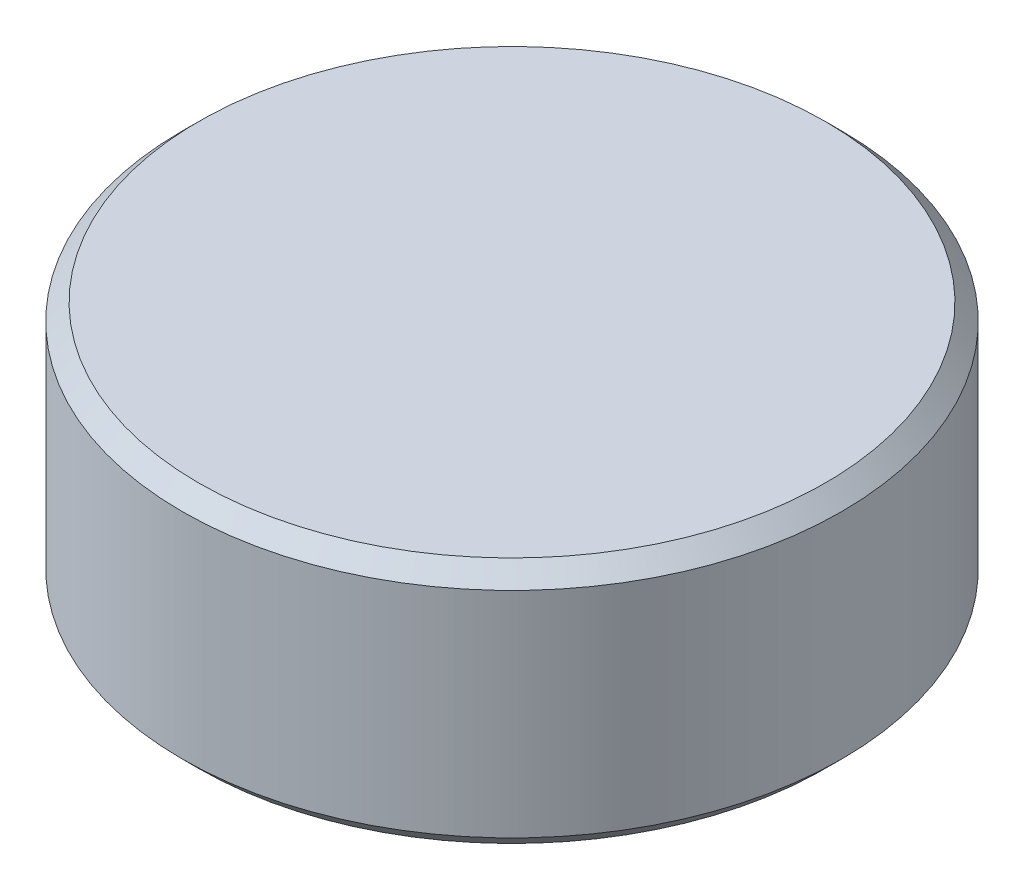
ISO-10303-21;
HEADER;
FILE_DESCRIPTION(('STEP AP214'),'2;1');
FILE_NAME('part.step','',(''),(''),'','','');
FILE_SCHEMA(('AUTOMOTIVE_DESIGN { 1 0 10303 214 1 1 1 1 }'));
ENDSEC;
DATA;
#1=APPLICATION_CONTEXT('core data for automotive mechanical design processes');
#2=APPLICATION_PROTOCOL_DEFINITION('international standard','automotive_design',2000,#1);
#3=PRODUCT_CONTEXT('',#1,'mechanical');
#4=PRODUCT('Part','Part','',(#3));
#5=PRODUCT_RELATED_PRODUCT_CATEGORY('part','',(#4));
#6=PRODUCT_DEFINITION_FORMATION('','',#4);
#7=PRODUCT_DEFINITION_CONTEXT('part definition',#1,'design');
#8=PRODUCT_DEFINITION('design','',#6,#7);
#9=PRODUCT_DEFINITION_SHAPE('','',#8);
#10=(LENGTH_UNIT() NAMED_UNIT(*) SI_UNIT(.MILLI.,.METRE.));
#11=(NAMED_UNIT(*) PLANE_ANGLE_UNIT() SI_UNIT($,.RADIAN.));
#12=(NAMED_UNIT(*) SI_UNIT($,.STERADIAN.) SOLID_ANGLE_UNIT());
#13=UNCERTAINTY_MEASURE_WITH_UNIT(LENGTH_MEASURE(1.E-05),#10,'distance_accuracy_value','');
#14=(GEOMETRIC_REPRESENTATION_CONTEXT(3) GLOBAL_UNCERTAINTY_ASSIGNED_CONTEXT((#13)) GLOBAL_UNIT_ASSIGNED_CONTEXT((#10,
#11,#12)) REPRESENTATION_CONTEXT('',''));
#15=CARTESIAN_POINT('',(0.,0.,0.));
#16=DIRECTION('',(0.,0.,1.));
#17=DIRECTION('',(1.,0.,0.));
#18=AXIS2_PLACEMENT_3D('',#15,#16,#17);
#19=CARTESIAN_POINT('',(0.,1.5,0.));
#20=DIRECTION('',(0.,-1.,0.));
#21=DIRECTION('',(0.,0.,-1.));
#22=AXIS2_PLACEMENT_3D('',#19,#20,#21);
#23=CYLINDRICAL_SURFACE('',#22,2.);
#24=CARTESIAN_POINT('',(0.,0.0999999999999998,0.));
#25=DIRECTION('',(0.,1.,0.));
#26=DIRECTION('',(0.,0.,1.));
#27=AXIS2_PLACEMENT_3D('',#24,#25,#26);
#28=CIRCLE('',#27,2.);
#29=CARTESIAN_POINT('',(0.,0.0999999999999998,2.));
#30=VERTEX_POINT('',#29);
#31=EDGE_CURVE('E57',#30,#30,#28,.T.);
#32=ORIENTED_EDGE('',*,*,#31,.T.);
#33=EDGE_LOOP('',(#32));
#34=FACE_BOUND('',#33,.T.);
#35=CARTESIAN_POINT('',(0.,1.4,0.));
#36=DIRECTION('',(0.,1.,0.));
#37=DIRECTION('',(0.,0.,1.));
#38=AXIS2_PLACEMENT_3D('',#35,#36,#37);
#39=CIRCLE('',#38,2.);
#40=CARTESIAN_POINT('',(0.,1.4,2.));
#41=VERTEX_POINT('',#40);
#42=EDGE_CURVE('E62',#41,#41,#39,.F.);
#43=ORIENTED_EDGE('',*,*,#42,.T.);
#44=EDGE_LOOP('',(#43));
#45=FACE_BOUND('',#44,.T.);
#46=ADVANCED_FACE('F43',(#34,#45),#23,.T.);
#47=CARTESIAN_POINT('',(0.,1.5,0.));
#48=DIRECTION('',(0.,1.,0.));
#49=DIRECTION('',(0.,0.,1.));
#50=AXIS2_PLACEMENT_3D('',#47,#48,#49);
#51=PLANE('',#50);
#52=CARTESIAN_POINT('',(0.,1.5,0.));
#53=DIRECTION('',(0.,1.,0.));
#54=DIRECTION('',(0.,0.,1.));
#55=AXIS2_PLACEMENT_3D('',#52,#53,#54);
#56=CIRCLE('',#55,1.9);
#57=CARTESIAN_POINT('',(0.,1.5,1.9));
#58=VERTEX_POINT('',#57);
#59=EDGE_CURVE('E10',#58,#58,#56,.T.);
#60=ORIENTED_EDGE('',*,*,#59,.T.);
#61=EDGE_LOOP('',(#60));
#62=FACE_BOUND('',#61,.T.);
#63=ADVANCED_FACE('F79',(#62),#51,.T.);
#64=CARTESIAN_POINT('',(0.,0.,0.));
#65=DIRECTION('',(0.,1.,0.));
#66=DIRECTION('',(0.,0.,1.));
#67=AXIS2_PLACEMENT_3D('',#64,#65,#66);
#68=PLANE('',#67);
#69=CARTESIAN_POINT('',(0.,0.,0.));
#70=DIRECTION('',(0.,1.,0.));
#71=DIRECTION('',(0.,0.,1.));
#72=AXIS2_PLACEMENT_3D('',#69,#70,#71);
#73=CIRCLE('',#72,1.9);
#74=CARTESIAN_POINT('',(0.,0.,1.9));
#75=VERTEX_POINT('',#74);
#76=EDGE_CURVE('E52',#75,#75,#73,.F.);
#77=ORIENTED_EDGE('',*,*,#76,.T.);
#78=EDGE_LOOP('',(#77));
#79=FACE_BOUND('',#78,.T.);
#80=ADVANCED_FACE('F76',(#79),#68,.F.);
#81=CARTESIAN_POINT('',(0.,0.0999999999999998,0.));
#82=DIRECTION('',(0.,1.,0.));
#83=DIRECTION('',(0.,0.,1.));
#84=AXIS2_PLACEMENT_3D('',#81,#82,#83);
#85=CONICAL_SURFACE('',#84,2.,0.785398163397453);
#86=CARTESIAN_POINT('',(0.,0.,1.9));
#87=CARTESIAN_POINT('',(0.,0.0010416666666666,1.90104166666667));
#88=CARTESIAN_POINT('',(0.,0.00208333333333328,1.90208333333333));
#89=CARTESIAN_POINT('',(0.,0.00416666666666664,1.90416666666667));
#90=CARTESIAN_POINT('',(0.,0.00520833333333333,1.90520833333333));
#91=CARTESIAN_POINT('',(0.,0.00729166666666666,1.90729166666667));
#92=CARTESIAN_POINT('',(0.,0.00833333333333332,1.90833333333333));
#93=CARTESIAN_POINT('',(0.,0.0104166666666666,1.91041666666667));
#94=CARTESIAN_POINT('',(0.,0.0114583333333333,1.91145833333333));
#95=CARTESIAN_POINT('',(0.,0.0135416666666666,1.91354166666667));
#96=CARTESIAN_POINT('',(0.,0.0145833333333333,1.91458333333333));
#97=CARTESIAN_POINT('',(0.,0.0166666666666666,1.91666666666667));
#98=CARTESIAN_POINT('',(0.,0.0177083333333333,1.91770833333333));
#99=CARTESIAN_POINT('',(0.,0.0197916666666666,1.91979166666667));
#100=CARTESIAN_POINT('',(0.,0.0208333333333333,1.92083333333333));
#101=CARTESIAN_POINT('',(0.,0.0229166666666666,1.92291666666667));
#102=CARTESIAN_POINT('',(0.,0.0239583333333333,1.92395833333333));
#103=CARTESIAN_POINT('',(0.,0.0260416666666666,1.92604166666667));
#104=CARTESIAN_POINT('',(0.,0.0270833333333333,1.92708333333333));
#105=CARTESIAN_POINT('',(0.,0.0291666666666666,1.92916666666667));
#106=CARTESIAN_POINT('',(0.,0.0302083333333332,1.93020833333333));
#107=CARTESIAN_POINT('',(0.,0.0322916666666666,1.93229166666667));
#108=CARTESIAN_POINT('',(0.,0.0333333333333333,1.93333333333333));
#109=CARTESIAN_POINT('',(0.,0.0354166666666666,1.93541666666667));
#110=CARTESIAN_POINT('',(0.,0.0364583333333333,1.93645833333333));
#111=CARTESIAN_POINT('',(0.,0.0385416666666666,1.93854166666667));
#112=CARTESIAN_POINT('',(0.,0.0395833333333333,1.93958333333333));
#113=CARTESIAN_POINT('',(0.,0.0416666666666666,1.94166666666667));
#114=CARTESIAN_POINT('',(0.,0.0427083333333332,1.94270833333333));
#115=CARTESIAN_POINT('',(0.,0.0447916666666666,1.94479166666667));
#116=CARTESIAN_POINT('',(0.,0.0458333333333333,1.94583333333333));
#117=CARTESIAN_POINT('',(0.,0.0479166666666666,1.94791666666667));
#118=CARTESIAN_POINT('',(0.,0.0489583333333333,1.94895833333333));
#119=CARTESIAN_POINT('',(0.,0.0510416666666666,1.95104166666667));
#120=CARTESIAN_POINT('',(0.,0.0520833333333332,1.95208333333333));
#121=CARTESIAN_POINT('',(0.,0.0541666666666666,1.95416666666667));
#122=CARTESIAN_POINT('',(0.,0.0552083333333332,1.95520833333333));
#123=CARTESIAN_POINT('',(0.,0.0572916666666666,1.95729166666667));
#124=CARTESIAN_POINT('',(0.,0.0583333333333332,1.95833333333333));
#125=CARTESIAN_POINT('',(0.,0.0604166666666665,1.96041666666667));
#126=CARTESIAN_POINT('',(0.,0.0614583333333332,1.96145833333333));
#127=CARTESIAN_POINT('',(0.,0.0635416666666666,1.96354166666667));
#128=CARTESIAN_POINT('',(0.,0.0645833333333332,1.96458333333333));
#129=CARTESIAN_POINT('',(0.,0.0666666666666665,1.96666666666667));
#130=CARTESIAN_POINT('',(0.,0.0677083333333332,1.96770833333333));
#131=CARTESIAN_POINT('',(0.,0.0697916666666665,1.96979166666667));
#132=CARTESIAN_POINT('',(0.,0.0708333333333332,1.97083333333333));
#133=CARTESIAN_POINT('',(0.,0.0729166666666666,1.97291666666667));
#134=CARTESIAN_POINT('',(0.,0.0739583333333332,1.97395833333333));
#135=CARTESIAN_POINT('',(0.,0.0760416666666665,1.97604166666667));
#136=CARTESIAN_POINT('',(0.,0.0770833333333332,1.97708333333333));
#137=CARTESIAN_POINT('',(0.,0.0791666666666665,1.97916666666667));
#138=CARTESIAN_POINT('',(0.,0.0802083333333332,1.98020833333333));
#139=CARTESIAN_POINT('',(0.,0.0822916666666665,1.98229166666667));
#140=CARTESIAN_POINT('',(0.,0.0833333333333332,1.98333333333333));
#141=CARTESIAN_POINT('',(0.,0.0854166666666665,1.98541666666667));
#142=CARTESIAN_POINT('',(0.,0.0864583333333331,1.98645833333333));
#143=CARTESIAN_POINT('',(0.,0.0885416666666665,1.98854166666667));
#144=CARTESIAN_POINT('',(0.,0.0895833333333332,1.98958333333333));
#145=CARTESIAN_POINT('',(0.,0.0916666666666666,1.99166666666667));
#146=CARTESIAN_POINT('',(0.,0.0927083333333332,1.99270833333333));
#147=CARTESIAN_POINT('',(0.,0.0947916666666665,1.99479166666667));
#148=CARTESIAN_POINT('',(0.,0.0958333333333332,1.99583333333333));
#149=CARTESIAN_POINT('',(0.,0.0979166666666665,1.99791666666667));
#150=CARTESIAN_POINT('',(0.,0.0989583333333332,1.99895833333333));
#151=CARTESIAN_POINT('',(0.,0.0999999999999998,2.));
#152=B_SPLINE_CURVE_WITH_KNOTS('',3,(#86,#87,#88,#89,#90,#91,#92,#93,#94,#95,#96,#97,#98,#99,
#100,#101,#102,#103,#104,#105,#106,#107,#108,#109,#110,#111,#112,#113,#114,#115,#116,#117,#118,
#119,#120,#121,#122,#123,#124,#125,#126,#127,#128,#129,#130,#131,#132,#133,#134,#135,#136,#137,
#138,#139,#140,#141,#142,#143,#144,#145,#146,#147,#148,#149,#150,#151),.UNSPECIFIED.,.F.,.F.,(4,
2,2,2,2,2,2,2,2,2,2,2,2,2,2,2,2,2,2,2,2,2,2,2,2,2,2,2,2,2,2,2,4),(0.,0.00441941738241598,
0.00883883476483181,0.0132582521472478,0.0176776695296638,0.0220970869120796,0.0265165042944956,
0.0309359216769116,0.0353553390593274,0.0397747564417434,0.0441941738241593,0.0486135912065752,
0.0530330085889912,0.0574524259714071,0.0618718433538231,0.066291260736239,0.0707106781186549,
0.0751300955010709,0.0795495128834868,0.0839689302659027,0.0883883476483187,0.0928077650307347,
0.0972271824131507,0.101646599795566,0.106066017177982,0.110485434560398,0.114904851942814,
0.11932426932523,0.123743686707646,0.128163104090062,0.132582521472478,0.137001938854894,
0.14142135623731),.UNSPECIFIED.);
#153=EDGE_CURVE('BSEAM72',#75,#30,#152,.T.);
#154=ORIENTED_EDGE('',*,*,#76,.F.);
#155=ORIENTED_EDGE('',*,*,#31,.F.);
#156=ORIENTED_EDGE('',*,*,#153,.T.);
#157=ORIENTED_EDGE('',*,*,#153,.F.);
#158=EDGE_LOOP('',(#154,#156,#155,#157));
#159=FACE_BOUND('',#158,.T.);
#160=ADVANCED_FACE('F72',(#159),#85,.T.);
#161=CARTESIAN_POINT('',(0.,1.5,0.));
#162=DIRECTION('',(0.,-1.,0.));
#163=DIRECTION('',(0.,0.,-1.));
#164=AXIS2_PLACEMENT_3D('',#161,#162,#163);
#165=CONICAL_SURFACE('',#164,1.9,0.785398163397444);
#166=ORIENTED_EDGE('',*,*,#42,.F.);
#167=EDGE_LOOP('',(#166));
#168=FACE_BOUND('',#167,.T.);
#169=ORIENTED_EDGE('',*,*,#59,.F.);
#170=EDGE_LOOP('',(#169));
#171=FACE_BOUND('',#170,.T.);
#172=ADVANCED_FACE('F46',(#168,#171),#165,.T.);
#173=CLOSED_SHELL('',(#46,#63,#80,#160,#172));
#174=MANIFOLD_SOLID_BREP('B2',#173);
#175=ADVANCED_BREP_SHAPE_REPRESENTATION('',(#18,#174),#14);
#176=SHAPE_DEFINITION_REPRESENTATION(#9,#175);
ENDSEC;
END-ISO-10303-21;
